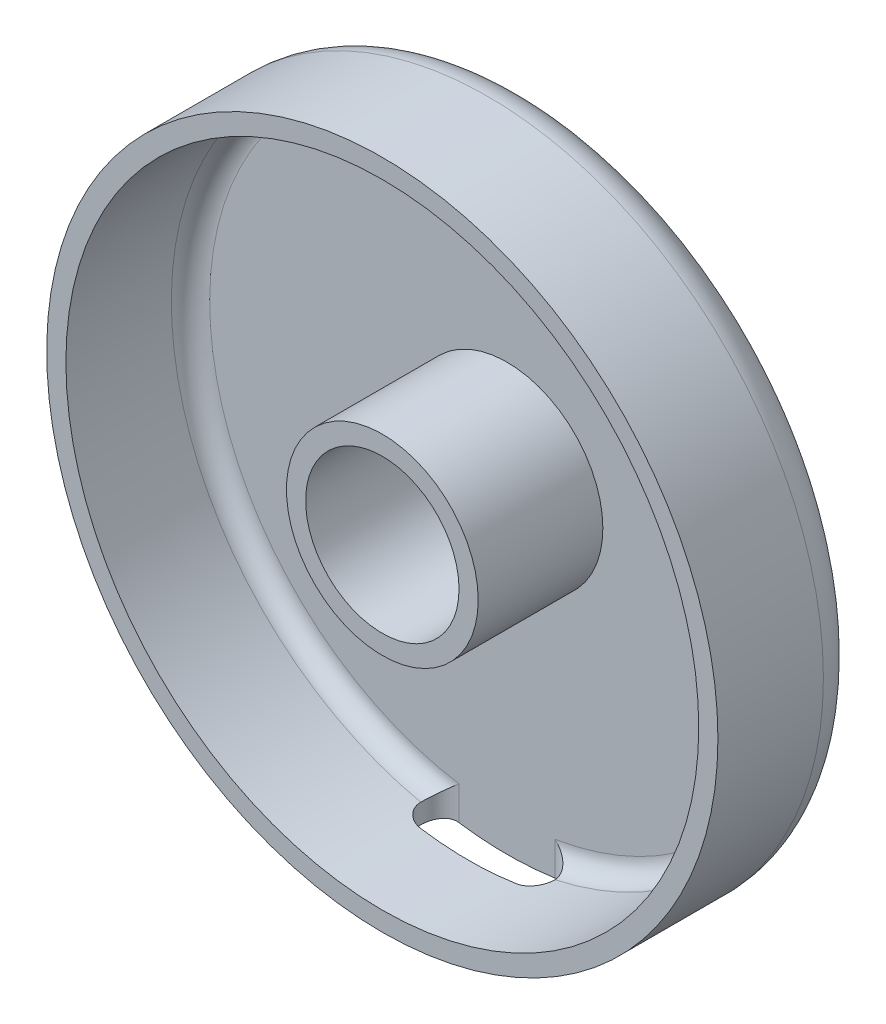
ISO-10303-21;
HEADER;
FILE_DESCRIPTION(('STEP AP214'),'2;1');
FILE_NAME('part.step','',(''),(''),'','','');
FILE_SCHEMA(('AUTOMOTIVE_DESIGN { 1 0 10303 214 1 1 1 1 }'));
ENDSEC;
DATA;
#1=APPLICATION_CONTEXT('core data for automotive mechanical design processes');
#2=APPLICATION_PROTOCOL_DEFINITION('international standard','automotive_design',2000,#1);
#3=PRODUCT_CONTEXT('',#1,'mechanical');
#4=PRODUCT('Part','Part','',(#3));
#5=PRODUCT_RELATED_PRODUCT_CATEGORY('part','',(#4));
#6=PRODUCT_DEFINITION_FORMATION('','',#4);
#7=PRODUCT_DEFINITION_CONTEXT('part definition',#1,'design');
#8=PRODUCT_DEFINITION('design','',#6,#7);
#9=PRODUCT_DEFINITION_SHAPE('','',#8);
#10=(LENGTH_UNIT() NAMED_UNIT(*) SI_UNIT(.MILLI.,.METRE.));
#11=(NAMED_UNIT(*) PLANE_ANGLE_UNIT() SI_UNIT($,.RADIAN.));
#12=(NAMED_UNIT(*) SI_UNIT($,.STERADIAN.) SOLID_ANGLE_UNIT());
#13=UNCERTAINTY_MEASURE_WITH_UNIT(LENGTH_MEASURE(1.E-05),#10,'distance_accuracy_value','');
#14=(GEOMETRIC_REPRESENTATION_CONTEXT(3) GLOBAL_UNCERTAINTY_ASSIGNED_CONTEXT((#13)) GLOBAL_UNIT_ASSIGNED_CONTEXT((#10,
#11,#12)) REPRESENTATION_CONTEXT('',''));
#15=CARTESIAN_POINT('',(0.,0.,0.));
#16=DIRECTION('',(0.,0.,1.));
#17=DIRECTION('',(1.,0.,0.));
#18=AXIS2_PLACEMENT_3D('',#15,#16,#17);
#19=CARTESIAN_POINT('',(0.,0.,15.));
#20=DIRECTION('',(0.,0.,1.));
#21=DIRECTION('',(1.,0.,0.));
#22=AXIS2_PLACEMENT_3D('',#19,#20,#21);
#23=PLANE('',#22);
#24=CARTESIAN_POINT('',(0.,0.,15.));
#25=DIRECTION('',(0.,0.,1.));
#26=DIRECTION('',(1.,0.,0.));
#27=AXIS2_PLACEMENT_3D('',#24,#25,#26);
#28=CIRCLE('',#27,8.);
#29=CARTESIAN_POINT('',(8.,0.,15.));
#30=VERTEX_POINT('',#29);
#31=EDGE_CURVE('E175',#30,#30,#28,.T.);
#32=ORIENTED_EDGE('',*,*,#31,.F.);
#33=EDGE_LOOP('',(#32));
#34=FACE_BOUND('',#33,.T.);
#35=CARTESIAN_POINT('',(0.,0.,15.));
#36=DIRECTION('',(0.,0.,1.));
#37=DIRECTION('',(1.,0.,0.));
#38=AXIS2_PLACEMENT_3D('',#35,#36,#37);
#39=CIRCLE('',#38,10.);
#40=CARTESIAN_POINT('',(10.,0.,15.));
#41=VERTEX_POINT('',#40);
#42=EDGE_CURVE('E98',#41,#41,#39,.T.);
#43=ORIENTED_EDGE('',*,*,#42,.T.);
#44=EDGE_LOOP('',(#43));
#45=FACE_BOUND('',#44,.T.);
#46=ADVANCED_FACE('F33',(#34,#45),#23,.T.);
#47=CARTESIAN_POINT('',(0.,0.,15.));
#48=DIRECTION('',(0.,0.,-1.));
#49=DIRECTION('',(-1.,0.,0.));
#50=AXIS2_PLACEMENT_3D('',#47,#48,#49);
#51=CYLINDRICAL_SURFACE('',#50,35.);
#52=CARTESIAN_POINT('',(0.,0.,4.));
#53=DIRECTION('',(0.,0.,1.));
#54=DIRECTION('',(1.,0.,0.));
#55=AXIS2_PLACEMENT_3D('',#52,#53,#54);
#56=CIRCLE('',#55,35.);
#57=CARTESIAN_POINT('',(7.,-34.2928563989645,4.));
#58=VERTEX_POINT('',#57);
#59=CARTESIAN_POINT('',(-7.,-34.2928563989645,4.));
#60=VERTEX_POINT('',#59);
#61=EDGE_CURVE('E192',#58,#60,#56,.T.);
#62=ORIENTED_EDGE('',*,*,#61,.T.);
#63=CARTESIAN_POINT('',(-7.,-34.2928563989645,4.));
#64=CARTESIAN_POINT('',(-7.00000024530008,-34.2928555590461,4.05551355530177));
#65=CARTESIAN_POINT('',(-6.99768719378157,-34.2933285851383,4.11100014356259));
#66=CARTESIAN_POINT('',(-6.9884636017292,-34.2952097134133,4.22156839814736));
#67=CARTESIAN_POINT('',(-6.9815535157915,-34.2966177231365,4.27665010396523));
#68=CARTESIAN_POINT('',(-6.95401289387718,-34.3022168043985,4.44052674764076));
#69=CARTESIAN_POINT('',(-6.92657168154917,-34.3077830497015,4.54821132621806));
#70=CARTESIAN_POINT('',(-6.85437600773371,-34.3222794650378,4.75732863114436));
#71=CARTESIAN_POINT('',(-6.80961750180681,-34.3312104208836,4.8587598906155));
#72=CARTESIAN_POINT('',(-6.70414730815314,-34.3519619063264,5.05264191439974));
#73=CARTESIAN_POINT('',(-6.64343523137788,-34.3637825063906,5.14509245963118));
#74=CARTESIAN_POINT('',(-6.50713708225238,-34.3898533831215,5.3194349637285));
#75=CARTESIAN_POINT('',(-6.43140571292647,-34.404127196416,5.40120969889844));
#76=CARTESIAN_POINT('',(-6.26760925689824,-34.4343432891605,5.55096207681369));
#77=CARTESIAN_POINT('',(-6.17954109511379,-34.4502859843465,5.61893626924223));
#78=CARTESIAN_POINT('',(-5.99184757603775,-34.4834307316268,5.74039033875451));
#79=CARTESIAN_POINT('',(-5.8920440114934,-34.5006501812278,5.793589890895));
#80=CARTESIAN_POINT('',(-5.68497216612578,-34.5353744470497,5.88241609208592));
#81=CARTESIAN_POINT('',(-5.57770742555432,-34.552879124954,5.9180510113413));
#82=CARTESIAN_POINT('',(-5.39164042562375,-34.5823109799937,5.96286384332794));
#83=CARTESIAN_POINT('',(-5.31395887068838,-34.5943352148722,5.97677250905686));
#84=CARTESIAN_POINT('',(-5.15754252987711,-34.6180022564221,5.99534108602722));
#85=CARTESIAN_POINT('',(-5.07880918450185,-34.6296455218188,6.00001255556704));
#86=CARTESIAN_POINT('',(-5.,-34.6410161513776,6.));
#87=B_SPLINE_CURVE_WITH_KNOTS('',3,(#63,#64,#65,#66,#67,#68,#69,#70,#71,#72,#73,#74,#75,#76,#77,
#78,#79,#80,#81,#82,#83,#84,#85,#86),.UNSPECIFIED.,.F.,.F.,(4,2,2,2,2,2,2,2,2,2,2,4),(0.,
0.166437126251119,0.332857796146538,0.66493476339948,0.997089333811798,1.32925200499525,
1.66480026794702,2.00043231934013,2.34205427832008,2.68351523257436,2.92248444549073,
3.16115445184396),.UNSPECIFIED.);
#88=CARTESIAN_POINT('',(-5.,-34.6410161513776,6.));
#89=VERTEX_POINT('',#88);
#90=EDGE_CURVE('E93',#60,#89,#87,.T.);
#91=ORIENTED_EDGE('',*,*,#90,.T.);
#92=CARTESIAN_POINT('',(0.,0.,6.));
#93=DIRECTION('',(0.,0.,1.));
#94=DIRECTION('',(1.,0.,0.));
#95=AXIS2_PLACEMENT_3D('',#92,#93,#94);
#96=CIRCLE('',#95,35.);
#97=CARTESIAN_POINT('',(5.,-34.6410161513776,6.));
#98=VERTEX_POINT('',#97);
#99=EDGE_CURVE('E86',#89,#98,#96,.T.);
#100=ORIENTED_EDGE('',*,*,#99,.T.);
#101=CARTESIAN_POINT('',(5.,-34.6410161513776,6.));
#102=CARTESIAN_POINT('',(5.05695062841561,-34.6327968394874,5.99999935998623));
#103=CARTESIAN_POINT('',(5.11385274952817,-34.6244393737466,5.99756603626248));
#104=CARTESIAN_POINT('',(5.22720720797549,-34.6075075796392,5.98786720303881));
#105=CARTESIAN_POINT('',(5.28365957576101,-34.5989332661213,5.98060202354457));
#106=CARTESIAN_POINT('',(5.45165220241039,-34.5729991146888,5.95163769943295));
#107=CARTESIAN_POINT('',(5.56200532845806,-34.5554024172875,5.92276954139059));
#108=CARTESIAN_POINT('',(5.77620788126942,-34.5202439513139,5.84673777672149));
#109=CARTESIAN_POINT('',(5.88005477947362,-34.5026821988584,5.79956710766766));
#110=CARTESIAN_POINT('',(6.07833427206034,-34.468303957287,5.68822765776918));
#111=CARTESIAN_POINT('',(6.17276832854968,-34.4514873526527,5.62406152252932));
#112=CARTESIAN_POINT('',(6.34945874201338,-34.4193615543715,5.48051100933139));
#113=CARTESIAN_POINT('',(6.43172247410127,-34.404051449698,5.40113591536918));
#114=CARTESIAN_POINT('',(6.58172257793654,-34.3756712008395,5.22929160065911));
#115=CARTESIAN_POINT('',(6.64945685510899,-34.3626013796695,5.13682049516819));
#116=CARTESIAN_POINT('',(6.76755997390268,-34.3395358476454,4.94260196129102));
#117=CARTESIAN_POINT('',(6.81812949674207,-34.3295047700626,4.84098066405441));
#118=CARTESIAN_POINT('',(6.90140198536068,-34.3128615635967,4.63044231809053));
#119=CARTESIAN_POINT('',(6.93412015993054,-34.3062465246136,4.52153156885347));
#120=CARTESIAN_POINT('',(6.9715504714405,-34.2986543055428,4.34315718701884));
#121=CARTESIAN_POINT('',(6.98221180130755,-34.2964838790439,4.27493567951671));
#122=CARTESIAN_POINT('',(6.99643525916125,-34.2935841079102,4.13782038199207));
#123=CARTESIAN_POINT('',(7.00000701015909,-34.2928528098919,4.06892763097816));
#124=CARTESIAN_POINT('',(7.,-34.2928563989645,4.));
#125=B_SPLINE_CURVE_WITH_KNOTS('',3,(#101,#102,#103,#104,#105,#106,#107,#108,#109,#110,#111,
#112,#113,#114,#115,#116,#117,#118,#119,#120,#121,#122,#123,#124),.UNSPECIFIED.,.F.,.F.,(4,2,2,
2,2,2,2,2,2,2,2,4),(0.,0.172514735017035,0.345017688847394,0.689492877116225,1.03410112113017,
1.37865575308445,1.72300072498184,2.06739530454463,2.40761227498084,2.74753893677924,
2.95443865653663,3.16105734922718),.UNSPECIFIED.);
#126=EDGE_CURVE('E91',#98,#58,#125,.T.);
#127=ORIENTED_EDGE('',*,*,#126,.T.);
#128=EDGE_LOOP('',(#62,#91,#100,#127));
#129=FACE_BOUND('',#128,.T.);
#130=CARTESIAN_POINT('',(0.,0.,15.));
#131=DIRECTION('',(0.,0.,1.));
#132=DIRECTION('',(1.,0.,0.));
#133=AXIS2_PLACEMENT_3D('',#130,#131,#132);
#134=CIRCLE('',#133,35.);
#135=CARTESIAN_POINT('',(35.,0.,15.));
#136=VERTEX_POINT('',#135);
#137=EDGE_CURVE('E181',#136,#136,#134,.T.);
#138=ORIENTED_EDGE('',*,*,#137,.F.);
#139=EDGE_LOOP('',(#138));
#140=FACE_BOUND('',#139,.T.);
#141=ADVANCED_FACE('F89',(#129,#140),#51,.T.);
#142=CARTESIAN_POINT('',(0.,0.,15.));
#143=DIRECTION('',(0.,0.,1.));
#144=DIRECTION('',(1.,0.,0.));
#145=AXIS2_PLACEMENT_3D('',#142,#143,#144);
#146=CIRCLE('',#145,33.);
#147=CARTESIAN_POINT('',(33.,0.,15.));
#148=VERTEX_POINT('',#147);
#149=EDGE_CURVE('E172',#148,#148,#146,.T.);
#150=ORIENTED_EDGE('',*,*,#149,.F.);
#151=EDGE_LOOP('',(#150));
#152=FACE_BOUND('',#151,.T.);
#153=ORIENTED_EDGE('',*,*,#137,.T.);
#154=EDGE_LOOP('',(#153));
#155=FACE_BOUND('',#154,.T.);
#156=ADVANCED_FACE('F222',(#152,#155),#23,.T.);
#157=CARTESIAN_POINT('',(0.,0.,0.));
#158=DIRECTION('',(0.,0.,1.));
#159=DIRECTION('',(1.,0.,0.));
#160=AXIS2_PLACEMENT_3D('',#157,#158,#159);
#161=PLANE('',#160);
#162=CARTESIAN_POINT('',(0.,0.,0.));
#163=DIRECTION('',(0.,0.,1.));
#164=DIRECTION('',(1.,0.,0.));
#165=AXIS2_PLACEMENT_3D('',#162,#163,#164);
#166=CIRCLE('',#165,31.);
#167=CARTESIAN_POINT('',(31.,0.,0.));
#168=VERTEX_POINT('',#167);
#169=EDGE_CURVE('E193',#168,#168,#166,.F.);
#170=ORIENTED_EDGE('',*,*,#169,.T.);
#171=EDGE_LOOP('',(#170));
#172=FACE_BOUND('',#171,.T.);
#173=CARTESIAN_POINT('',(0.,0.,0.));
#174=DIRECTION('',(0.,0.,1.));
#175=DIRECTION('',(1.,0.,0.));
#176=AXIS2_PLACEMENT_3D('',#173,#174,#175);
#177=CIRCLE('',#176,8.);
#178=CARTESIAN_POINT('',(8.,0.,0.));
#179=VERTEX_POINT('',#178);
#180=EDGE_CURVE('E178',#179,#179,#177,.T.);
#181=ORIENTED_EDGE('',*,*,#180,.T.);
#182=EDGE_LOOP('',(#181));
#183=FACE_BOUND('',#182,.T.);
#184=ADVANCED_FACE('F230',(#172,#183),#161,.F.);
#185=CARTESIAN_POINT('',(0.,0.,0.));
#186=DIRECTION('',(0.,0.,1.));
#187=DIRECTION('',(1.,0.,0.));
#188=AXIS2_PLACEMENT_3D('',#185,#186,#187);
#189=CYLINDRICAL_SURFACE('',#188,8.);
#190=ORIENTED_EDGE('',*,*,#180,.F.);
#191=EDGE_LOOP('',(#190));
#192=FACE_BOUND('',#191,.T.);
#193=ORIENTED_EDGE('',*,*,#31,.T.);
#194=EDGE_LOOP('',(#193));
#195=FACE_BOUND('',#194,.T.);
#196=ADVANCED_FACE('F155',(#192,#195),#189,.F.);
#197=CARTESIAN_POINT('',(0.,0.,15.));
#198=DIRECTION('',(0.,0.,-1.));
#199=DIRECTION('',(-1.,0.,0.));
#200=AXIS2_PLACEMENT_3D('',#197,#198,#199);
#201=CYLINDRICAL_SURFACE('',#200,33.);
#202=CARTESIAN_POINT('',(-7.,-32.2490309931942,4.));
#203=CARTESIAN_POINT('',(-7.00000032170768,-32.2490300845433,4.0554183653388));
#204=CARTESIAN_POINT('',(-6.99769511363743,-32.2495313853145,4.11080976076309));
#205=CARTESIAN_POINT('',(-6.98850331936834,-32.2515248339393,4.22118730574932));
#206=CARTESIAN_POINT('',(-6.98161721596992,-32.2530168773743,4.27617349740002));
#207=CARTESIAN_POINT('',(-6.95417489418794,-32.2589495136072,4.43975537249226));
#208=CARTESIAN_POINT('',(-6.92683433451888,-32.2648467475484,4.54724103786594));
#209=CARTESIAN_POINT('',(-6.85491812614406,-32.2802018550038,4.755965904393));
#210=CARTESIAN_POINT('',(-6.81033898978307,-32.2896604490312,4.85720383671519));
#211=CARTESIAN_POINT('',(-6.70531079680312,-32.311633739594,5.05072870338102));
#212=CARTESIAN_POINT('',(-6.64486096016607,-32.3241485863369,5.14301519747122));
#213=CARTESIAN_POINT('',(-6.50908636555804,-32.3517640090769,5.31719168869916));
#214=CARTESIAN_POINT('',(-6.43359905465917,-32.3668925782486,5.39895039837916));
#215=CARTESIAN_POINT('',(-6.27033243009698,-32.3989172663636,5.54871893968728));
#216=CARTESIAN_POINT('',(-6.18254997554881,-32.4158138366758,5.6167252472807));
#217=CARTESIAN_POINT('',(-5.99524752533596,-32.4509823782138,5.73845032167571));
#218=CARTESIAN_POINT('',(-5.89552708290978,-32.4692751675269,5.79185446027313));
#219=CARTESIAN_POINT('',(-5.68859069637451,-32.5061680039266,5.88109678797164));
#220=CARTESIAN_POINT('',(-5.58137819676597,-32.5247679068516,5.91694298947087));
#221=CARTESIAN_POINT('',(-5.39476606783739,-32.556145764789,5.96226281129005));
#222=CARTESIAN_POINT('',(-5.3164818995682,-32.5690239781842,5.97639536284738));
#223=CARTESIAN_POINT('',(-5.15882488343747,-32.5943702521645,5.9952646734719));
#224=CARTESIAN_POINT('',(-5.0794534928392,-32.6068387976806,6.00001296616534));
#225=CARTESIAN_POINT('',(-5.,-32.6190128606002,6.));
#226=B_SPLINE_CURVE_WITH_KNOTS('',3,(#202,#203,#204,#205,#206,#207,#208,#209,#210,#211,#212,
#213,#214,#215,#216,#217,#218,#219,#220,#221,#222,#223,#224,#225),.UNSPECIFIED.,.F.,.F.,(4,2,2,
2,2,2,2,2,2,2,2,4),(0.,0.166151569851381,0.332285631042078,0.663764025517769,0.995309518788622,
1.32687131001151,1.66223342130417,1.99768136009837,2.33987127835792,2.6819048956696,
2.92313431208806,3.16406706315745),.UNSPECIFIED.);
#227=CARTESIAN_POINT('',(-7.,-32.2490309931942,4.));
#228=VERTEX_POINT('',#227);
#229=CARTESIAN_POINT('',(-5.,-32.6190128606002,6.));
#230=VERTEX_POINT('',#229);
#231=EDGE_CURVE('E99',#228,#230,#226,.T.);
#232=ORIENTED_EDGE('',*,*,#231,.F.);
#233=CARTESIAN_POINT('',(0.,0.,4.));
#234=DIRECTION('',(0.,0.,1.));
#235=DIRECTION('',(1.,0.,0.));
#236=AXIS2_PLACEMENT_3D('',#233,#234,#235);
#237=CIRCLE('',#236,33.);
#238=CARTESIAN_POINT('',(7.,-32.2490309931942,4.));
#239=VERTEX_POINT('',#238);
#240=EDGE_CURVE('E189',#228,#239,#237,.F.);
#241=ORIENTED_EDGE('',*,*,#240,.T.);
#242=CARTESIAN_POINT('',(5.,-32.6190128606002,6.));
#243=CARTESIAN_POINT('',(5.05703788892853,-32.610270675137,5.99999932510374));
#244=CARTESIAN_POINT('',(5.11402444209582,-32.6013813296134,5.99755858384355));
#245=CARTESIAN_POINT('',(5.22754155933696,-32.5833715857668,5.98783131755712));
#246=CARTESIAN_POINT('',(5.2840721554855,-32.5742512038864,5.98054513645019));
#247=CARTESIAN_POINT('',(5.45229108586844,-32.5466645660512,5.95149898556187));
#248=CARTESIAN_POINT('',(5.56278263571616,-32.52794577425,5.92255117534897));
#249=CARTESIAN_POINT('',(5.77723499843109,-32.4905439043457,5.84631506738926));
#250=CARTESIAN_POINT('',(5.88119335472219,-32.4718608422076,5.79901991815695));
#251=CARTESIAN_POINT('',(6.07967080699351,-32.4352861337783,5.68738392280152));
#252=CARTESIAN_POINT('',(6.17419133790792,-32.4173943674092,5.62304567337479));
#253=CARTESIAN_POINT('',(6.35101731389473,-32.3832163411943,5.4791021739577));
#254=CARTESIAN_POINT('',(6.43333098677215,-32.3669290024229,5.39950729113726));
#255=CARTESIAN_POINT('',(6.58338632076632,-32.3367422268268,5.22716678173189));
#256=CARTESIAN_POINT('',(6.65112598633155,-32.3228431170636,5.13441935711112));
#257=CARTESIAN_POINT('',(6.76907851432686,-32.298346220925,4.93975601066958));
#258=CARTESIAN_POINT('',(6.81951902546768,-32.2877057693785,4.83798328855586));
#259=CARTESIAN_POINT('',(6.90250167300495,-32.2700679524697,4.62713171107798));
#260=CARTESIAN_POINT('',(6.93505966990316,-32.2630673591106,4.51805942655328));
#261=CARTESIAN_POINT('',(6.97205641319059,-32.255086818813,4.34011237756122));
#262=CARTESIAN_POINT('',(6.98252807544157,-32.2528198267005,4.27249072329926));
#263=CARTESIAN_POINT('',(6.99649852156503,-32.2497910932616,4.13659036793303));
#264=CARTESIAN_POINT('',(7.0000067095306,-32.2490273218645,4.06831267826646));
#265=CARTESIAN_POINT('',(7.,-32.2490309931942,4.));
#266=B_SPLINE_CURVE_WITH_KNOTS('',3,(#242,#243,#244,#245,#246,#247,#248,#249,#250,#251,#252,
#253,#254,#255,#256,#257,#258,#259,#260,#261,#262,#263,#264,#265),.UNSPECIFIED.,.F.,.F.,(4,2,2,
2,2,2,2,2,2,2,2,4),(0.,0.17300405358368,0.345995829007623,0.691451772923759,1.03703684555706,
1.38256929490764,1.72786777552686,2.07321350622467,2.41382258836363,2.75412908494541,
2.95918188228904,3.16395756923127),.UNSPECIFIED.);
#267=CARTESIAN_POINT('',(5.,-32.6190128606002,6.));
#268=VERTEX_POINT('',#267);
#269=EDGE_CURVE('E49',#268,#239,#266,.T.);
#270=ORIENTED_EDGE('',*,*,#269,.F.);
#271=CARTESIAN_POINT('',(0.,0.,6.));
#272=DIRECTION('',(0.,0.,1.));
#273=DIRECTION('',(1.,0.,0.));
#274=AXIS2_PLACEMENT_3D('',#271,#272,#273);
#275=CIRCLE('',#274,33.);
#276=EDGE_CURVE('E11',#230,#268,#275,.T.);
#277=ORIENTED_EDGE('',*,*,#276,.F.);
#278=EDGE_LOOP('',(#232,#241,#270,#277));
#279=FACE_BOUND('',#278,.T.);
#280=ORIENTED_EDGE('',*,*,#149,.T.);
#281=EDGE_LOOP('',(#280));
#282=FACE_BOUND('',#281,.T.);
#283=ADVANCED_FACE('F150',(#279,#282),#201,.F.);
#284=CARTESIAN_POINT('',(0.,0.,2.));
#285=DIRECTION('',(0.,0.,1.));
#286=DIRECTION('',(1.,0.,0.));
#287=AXIS2_PLACEMENT_3D('',#284,#285,#286);
#288=PLANE('',#287);
#289=CARTESIAN_POINT('',(0.,0.,2.));
#290=DIRECTION('',(0.,0.,1.));
#291=DIRECTION('',(1.,0.,0.));
#292=AXIS2_PLACEMENT_3D('',#289,#290,#291);
#293=CIRCLE('',#292,31.);
#294=CARTESIAN_POINT('',(5.,-30.5941170815567,2.));
#295=VERTEX_POINT('',#294);
#296=CARTESIAN_POINT('',(-5.,-30.5941170815567,2.));
#297=VERTEX_POINT('',#296);
#298=EDGE_CURVE('E186',#295,#297,#293,.T.);
#299=ORIENTED_EDGE('',*,*,#298,.T.);
#300=DIRECTION('',(0.,1.,0.));
#301=VECTOR('',#300,1.);
#302=CARTESIAN_POINT('',(-5.,-35.,2.));
#303=LINE('',#302,#301);
#304=CARTESIAN_POINT('',(-5.,-34.0994765376031,2.));
#305=VERTEX_POINT('',#304);
#306=EDGE_CURVE('E106',#305,#297,#303,.T.);
#307=ORIENTED_EDGE('',*,*,#306,.F.);
#308=CARTESIAN_POINT('',(0.,0.,2.));
#309=DIRECTION('',(0.,0.,-1.));
#310=DIRECTION('',(-1.,0.,0.));
#311=AXIS2_PLACEMENT_3D('',#308,#309,#310);
#312=CIRCLE('',#311,34.4641016151378);
#313=CARTESIAN_POINT('',(5.,-34.0994765376031,2.));
#314=VERTEX_POINT('',#313);
#315=EDGE_CURVE('E197',#305,#314,#312,.F.);
#316=ORIENTED_EDGE('',*,*,#315,.T.);
#317=DIRECTION('',(0.,1.,0.));
#318=VECTOR('',#317,1.);
#319=CARTESIAN_POINT('',(5.,-35.,2.));
#320=LINE('',#319,#318);
#321=EDGE_CURVE('E55',#314,#295,#320,.T.);
#322=ORIENTED_EDGE('',*,*,#321,.T.);
#323=EDGE_LOOP('',(#299,#307,#316,#322));
#324=FACE_BOUND('',#323,.T.);
#325=CARTESIAN_POINT('',(0.,0.,2.));
#326=DIRECTION('',(0.,0.,1.));
#327=DIRECTION('',(1.,0.,0.));
#328=AXIS2_PLACEMENT_3D('',#325,#326,#327);
#329=CIRCLE('',#328,10.);
#330=CARTESIAN_POINT('',(10.,0.,2.));
#331=VERTEX_POINT('',#330);
#332=EDGE_CURVE('E169',#331,#331,#329,.T.);
#333=ORIENTED_EDGE('',*,*,#332,.F.);
#334=EDGE_LOOP('',(#333));
#335=FACE_BOUND('',#334,.T.);
#336=ADVANCED_FACE('F154',(#324,#335),#288,.T.);
#337=CARTESIAN_POINT('',(0.,0.,0.));
#338=DIRECTION('',(0.,0.,1.));
#339=DIRECTION('',(1.,0.,0.));
#340=AXIS2_PLACEMENT_3D('',#337,#338,#339);
#341=CYLINDRICAL_SURFACE('',#340,10.);
#342=ORIENTED_EDGE('',*,*,#332,.T.);
#343=EDGE_LOOP('',(#342));
#344=FACE_BOUND('',#343,.T.);
#345=ORIENTED_EDGE('',*,*,#42,.F.);
#346=EDGE_LOOP('',(#345));
#347=FACE_BOUND('',#346,.T.);
#348=ADVANCED_FACE('F217',(#344,#347),#341,.T.);
#349=CARTESIAN_POINT('',(0.,0.,4.));
#350=DIRECTION('',(0.,0.,1.));
#351=DIRECTION('',(1.,0.,0.));
#352=AXIS2_PLACEMENT_3D('',#349,#350,#351);
#353=TOROIDAL_SURFACE('',#352,31.,2.);
#354=ORIENTED_EDGE('',*,*,#240,.F.);
#355=CARTESIAN_POINT('',(-6.99999999,-32.2490309851319,4.0002));
#356=CARTESIAN_POINT('',(-7.00001484640282,-32.2490426103239,3.95279878732765));
#357=CARTESIAN_POINT('',(-6.99832462977569,-32.2476802585834,3.90540389690484));
#358=CARTESIAN_POINT('',(-6.99161148872657,-32.2422674567667,3.81102991617514));
#359=CARTESIAN_POINT('',(-6.98659034796843,-32.2382184453593,3.76405061696093));
#360=CARTESIAN_POINT('',(-6.97333394934684,-32.2275253798901,3.67114886981485));
#361=CARTESIAN_POINT('',(-6.96511884969167,-32.22089760115,3.62522166984233));
#362=CARTESIAN_POINT('',(-6.94561984181705,-32.2051594248597,3.53446714534701));
#363=CARTESIAN_POINT('',(-6.93433567349655,-32.1960488168917,3.48963991439688));
#364=CARTESIAN_POINT('',(-6.89617622518014,-32.1652232758017,3.35743044878589));
#365=CARTESIAN_POINT('',(-6.86495634041712,-32.1399843076301,3.27206528001837));
#366=CARTESIAN_POINT('',(-6.7926132802856,-32.0814080826102,3.1086186444367));
#367=CARTESIAN_POINT('',(-6.75147674796166,-32.0480599027497,3.03054720018715));
#368=CARTESIAN_POINT('',(-6.6577581705554,-31.9719403946093,2.87728709962706));
#369=CARTESIAN_POINT('',(-6.60455580689062,-31.928655528664,2.80273556710219));
#370=CARTESIAN_POINT('',(-6.49084897974946,-31.8359278843265,2.66379463382257));
#371=CARTESIAN_POINT('',(-6.43034116918357,-31.7864822829756,2.59940992255074));
#372=CARTESIAN_POINT('',(-6.2721304988293,-31.6568601477921,2.45126575807724));
#373=CARTESIAN_POINT('',(-6.17092830764083,-31.5736564623281,2.37385950555279));
#374=CARTESIAN_POINT('',(-5.96046499440294,-31.3998689556251,2.24129739785219));
#375=CARTESIAN_POINT('',(-5.85118612777133,-31.3092688357473,2.18619236754821));
#376=CARTESIAN_POINT('',(-5.62051956716443,-31.1171472989718,2.09437911199694));
#377=CARTESIAN_POINT('',(-5.49881296498772,-31.0153017582281,2.05916893850445));
#378=CARTESIAN_POINT('',(-5.2535478008938,-30.809009962717,2.01222400219097));
#379=CARTESIAN_POINT('',(-5.12999428390842,-30.7045704083648,2.00043406761524));
#380=CARTESIAN_POINT('',(-5.00457376990817,-30.5980038548479,2.00000392405555));
#381=CARTESIAN_POINT('',(-5.00228680772403,-30.5960604959448,2.00000000202132));
#382=CARTESIAN_POINT('',(-5.,-30.5941170815567,2.));
#383=B_SPLINE_CURVE_WITH_KNOTS('',3,(#355,#356,#357,#358,#359,#360,#361,#362,#363,#364,#365,
#366,#367,#368,#369,#370,#371,#372,#373,#374,#375,#376,#377,#378,#379,#380,#381,#382),
.UNSPECIFIED.,.F.,.F.,(4,2,2,2,2,2,2,2,2,2,2,2,2,4),(0.,0.14214281623841,0.284209578337639,
0.425393893153759,0.566590176954808,0.84821382829728,1.13021894537185,1.43301964249942,
1.73595960211498,2.18999461998546,2.64505864211021,3.13093095113405,3.61565731247322,
3.62466072707662),.UNSPECIFIED.);
#384=EDGE_CURVE('E164',#228,#297,#383,.T.);
#385=ORIENTED_EDGE('',*,*,#384,.T.);
#386=ORIENTED_EDGE('',*,*,#298,.F.);
#387=CARTESIAN_POINT('',(5.,-30.5941170815567,2.));
#388=CARTESIAN_POINT('',(5.00228680530062,-30.596060493999,2.00000000241326));
#389=CARTESIAN_POINT('',(5.00457376748023,-30.5980038528967,2.00000392443024));
#390=CARTESIAN_POINT('',(5.13557923053089,-30.7093157861689,2.00045320025271));
#391=CARTESIAN_POINT('',(5.26476437213546,-30.8184898738567,2.01331569576353));
#392=CARTESIAN_POINT('',(5.5209627768132,-31.0338797135704,2.06461431542902));
#393=CARTESIAN_POINT('',(5.64797057666306,-31.1400883537962,2.10310719589956));
#394=CARTESIAN_POINT('',(5.88049451099174,-31.3335903525382,2.20039770766979));
#395=CARTESIAN_POINT('',(5.98671725557002,-31.4215920690103,2.256069422756));
#396=CARTESIAN_POINT('',(6.19120128659427,-31.5903395670071,2.38883431457846));
#397=CARTESIAN_POINT('',(6.28947543778914,-31.6710970972874,2.46589194455983));
#398=CARTESIAN_POINT('',(6.45386433346956,-31.80573009507,2.62294992981013));
#399=CARTESIAN_POINT('',(6.5223411583675,-31.8616448303582,2.69872201680249));
#400=CARTESIAN_POINT('',(6.64905059979442,-31.9648758556261,2.86359991150911));
#401=CARTESIAN_POINT('',(6.70729352651367,-32.0122008010356,2.95269213030394));
#402=CARTESIAN_POINT('',(6.80182450476143,-32.0888781267529,3.12730574559243));
#403=CARTESIAN_POINT('',(6.84015030585827,-32.1199082986452,3.21098261635888));
#404=CARTESIAN_POINT('',(6.90546334252445,-32.1727337330387,3.38531567025686));
#405=CARTESIAN_POINT('',(6.9324702313453,-32.1945450030652,3.47595942997076));
#406=CARTESIAN_POINT('',(6.96844237952133,-32.223580777246,3.63892362558995));
#407=CARTESIAN_POINT('',(6.98021900006908,-32.2330797526539,3.71022432119429));
#408=CARTESIAN_POINT('',(6.99205994586286,-32.2426290244688,3.81829111655349));
#409=CARTESIAN_POINT('',(6.99503633502045,-32.2450289716526,3.85455613918368));
#410=CARTESIAN_POINT('',(6.99900965996828,-32.2482325637896,3.9272774305957));
#411=CARTESIAN_POINT('',(7.00000589250847,-32.2490356416169,3.96373376271374));
#412=CARTESIAN_POINT('',(6.99999999,-32.249030985132,4.0002));
#413=B_SPLINE_CURVE_WITH_KNOTS('',3,(#387,#388,#389,#390,#391,#392,#393,#394,#395,#396,#397,
#398,#399,#400,#401,#402,#403,#404,#405,#406,#407,#408,#409,#410,#411,#412),.UNSPECIFIED.,.F.,
.F.,(4,2,2,2,2,2,2,2,2,2,2,2,4),(0.,0.0090034146034045,0.515714911301165,1.02355222599861,
1.46814127598731,1.91199572974529,2.26000900174994,2.60766963037855,2.89785633144063,
3.18753706699751,3.4054970980772,3.51481484846755,3.62417141598283),.UNSPECIFIED.);
#414=EDGE_CURVE('E105',#295,#239,#413,.T.);
#415=ORIENTED_EDGE('',*,*,#414,.T.);
#416=EDGE_LOOP('',(#354,#385,#386,#415));
#417=FACE_BOUND('',#416,.T.);
#418=ADVANCED_FACE('F212',(#417),#353,.F.);
#419=CARTESIAN_POINT('',(0.,0.,4.));
#420=DIRECTION('',(0.,0.,1.));
#421=DIRECTION('',(1.,0.,0.));
#422=AXIS2_PLACEMENT_3D('',#419,#420,#421);
#423=TOROIDAL_SURFACE('',#422,31.,4.);
#424=CARTESIAN_POINT('',(-6.99999999,-34.2928563959026,4.0002));
#425=CARTESIAN_POINT('',(-7.00001229755739,-34.2928655749281,3.94520710716796));
#426=CARTESIAN_POINT('',(-6.99774295280627,-34.2921654655153,3.89021825854975));
#427=CARTESIAN_POINT('',(-6.98869384167864,-34.2894021426535,3.78065913998069));
#428=CARTESIAN_POINT('',(-6.98191506402654,-34.2873392280095,3.72608878092557));
#429=CARTESIAN_POINT('',(-6.96392452530632,-34.2819131413242,3.61790058329553));
#430=CARTESIAN_POINT('',(-6.95272491922048,-34.2785535350691,3.56428055069335));
#431=CARTESIAN_POINT('',(-6.92600169857854,-34.2706452412114,3.45823296624109));
#432=CARTESIAN_POINT('',(-6.91047798049092,-34.2660965251383,3.4058054429756));
#433=CARTESIAN_POINT('',(-6.85760748321813,-34.2508703501367,3.25088626024712));
#434=CARTESIAN_POINT('',(-6.81393931334351,-34.2386057662242,3.15062680001904));
#435=CARTESIAN_POINT('',(-6.71109081404948,-34.2113884928983,2.95882760853532));
#436=CARTESIAN_POINT('',(-6.65190119316748,-34.1964341950562,2.86729314514608));
#437=CARTESIAN_POINT('',(-6.51766105886833,-34.1653974452068,2.69264863591021));
#438=CARTESIAN_POINT('',(-6.44221006175964,-34.149295065228,2.60984925055625));
#439=CARTESIAN_POINT('',(-6.27834428807827,-34.1189061227061,2.45781652053363));
#440=CARTESIAN_POINT('',(-6.18992769939203,-34.104619814505,2.38858507533002));
#441=CARTESIAN_POINT('',(-6.00125987753539,-34.0805406443846,2.26496928762886));
#442=CARTESIAN_POINT('',(-5.90089020694975,-34.0707984315024,2.2107549124249));
#443=CARTESIAN_POINT('',(-5.69204810664867,-34.058883022232,2.1201106362024));
#444=CARTESIAN_POINT('',(-5.58358678413507,-34.0566996384398,2.08365685538009));
#445=CARTESIAN_POINT('',(-5.39534185697439,-34.0611578720739,2.03783291734041));
#446=CARTESIAN_POINT('',(-5.3166413189653,-34.0653641125357,2.02362949516223));
#447=CARTESIAN_POINT('',(-5.15844927877507,-34.0786957157688,2.00468459096633));
#448=CARTESIAN_POINT('',(-5.07895712178698,-34.0878255529859,1.99995173402719));
#449=CARTESIAN_POINT('',(-4.9998,-34.0995058688025,2.00000001));
#450=B_SPLINE_CURVE_WITH_KNOTS('',3,(#424,#425,#426,#427,#428,#429,#430,#431,#432,#433,#434,
#435,#436,#437,#438,#439,#440,#441,#442,#443,#444,#445,#446,#447,#448,#449),.UNSPECIFIED.,.F.,
.F.,(4,2,2,2,2,2,2,2,2,2,2,2,4),(0.,0.164919852433633,0.32980355695985,0.494237039854566,
0.658674460092764,0.987154675993847,1.3158319776318,1.65378523652985,1.99178577398003,
2.33346862612775,2.67469079592113,2.9142550715955,3.15403742527708),.UNSPECIFIED.);
#451=EDGE_CURVE('E42',#60,#305,#450,.T.);
#452=ORIENTED_EDGE('',*,*,#451,.F.);
#453=ORIENTED_EDGE('',*,*,#61,.F.);
#454=CARTESIAN_POINT('',(4.9998,-34.0995058688025,2.00000001));
#455=CARTESIAN_POINT('',(5.05081618146971,-34.0920095016979,1.99998663585463));
#456=CARTESIAN_POINT('',(5.10198374369044,-34.0855390821955,2.00194169987575));
#457=CARTESIAN_POINT('',(5.20422559089393,-34.0746523289558,2.00979604115281));
#458=CARTESIAN_POINT('',(5.25529989015742,-34.070235648849,2.0156946529081));
#459=CARTESIAN_POINT('',(5.35677195041052,-34.0634696835505,2.03141171097801));
#460=CARTESIAN_POINT('',(5.40717160741495,-34.0611121457078,2.04121427865789));
#461=CARTESIAN_POINT('',(5.50710461786182,-34.058340351225,2.06467491349434));
#462=CARTESIAN_POINT('',(5.55663798204316,-34.0579260704786,2.07833293282126));
#463=CARTESIAN_POINT('',(5.70338138769724,-34.0593913903913,2.12496407385246));
#464=CARTESIAN_POINT('',(5.79883410258556,-34.0639731063638,2.16360972573894));
#465=CARTESIAN_POINT('',(5.98234319300553,-34.0786032764521,2.25485324514157));
#466=CARTESIAN_POINT('',(6.0703936080732,-34.0886560882273,2.30746221713264));
#467=CARTESIAN_POINT('',(6.24026785263026,-34.1125469163323,2.42744089751185));
#468=CARTESIAN_POINT('',(6.32173587339393,-34.1265123840988,2.49528887830426));
#469=CARTESIAN_POINT('',(6.47285506362491,-34.1557073858034,2.64284782990165));
#470=CARTESIAN_POINT('',(6.54250241141673,-34.1709373261902,2.72256262172246));
#471=CARTESIAN_POINT('',(6.67279829553032,-34.201562024457,2.89796401612074));
#472=CARTESIAN_POINT('',(6.73249223870831,-34.2168954279851,2.99437370700027));
#473=CARTESIAN_POINT('',(6.83486314248239,-34.2443820063922,3.19621324174513));
#474=CARTESIAN_POINT('',(6.87754902088121,-34.2565368467284,3.30163832327429));
#475=CARTESIAN_POINT('',(6.94039208265754,-34.2748302214944,3.505246617716));
#476=CARTESIAN_POINT('',(6.96267758634015,-34.2815256471771,3.60272079794578));
#477=CARTESIAN_POINT('',(6.98503823529612,-34.2882899189693,3.75074747630076));
#478=CARTESIAN_POINT('',(6.990647237018,-34.2899982611516,3.80044323112519));
#479=CARTESIAN_POINT('',(6.99813169384871,-34.2922840535766,3.90015296025079));
#480=CARTESIAN_POINT('',(7.00000624006099,-34.2928612285138,3.95016700904819));
#481=CARTESIAN_POINT('',(6.99999999,-34.2928563959026,4.0002));
#482=B_SPLINE_CURVE_WITH_KNOTS('',3,(#454,#455,#456,#457,#458,#459,#460,#461,#462,#463,#464,
#465,#466,#467,#468,#469,#470,#471,#472,#473,#474,#475,#476,#477,#478,#479,#480,#481),
.UNSPECIFIED.,.F.,.F.,(4,2,2,2,2,2,2,2,2,2,2,2,2,4),(0.,0.154644311395204,0.309262532090925,
0.463258190765726,0.617251939096861,0.924941138967601,1.23287576886167,1.55232169829531,
1.87187071007386,2.21350437461806,2.55495867463676,2.85432642438581,3.00431267325957,
3.15433542152042),.UNSPECIFIED.);
#483=EDGE_CURVE('E104',#314,#58,#482,.T.);
#484=ORIENTED_EDGE('',*,*,#483,.F.);
#485=ORIENTED_EDGE('',*,*,#315,.F.);
#486=EDGE_LOOP('',(#452,#453,#484,#485));
#487=FACE_BOUND('',#486,.T.);
#488=ORIENTED_EDGE('',*,*,#169,.F.);
#489=EDGE_LOOP('',(#488));
#490=FACE_BOUND('',#489,.T.);
#491=ADVANCED_FACE('F35',(#487,#490),#423,.T.);
#492=CARTESIAN_POINT('',(-5.,-35.,6.));
#493=DIRECTION('',(0.,0.,1.));
#494=DIRECTION('',(1.,0.,0.));
#495=AXIS2_PLACEMENT_3D('',#492,#493,#494);
#496=PLANE('',#495);
#497=DIRECTION('',(0.,1.,0.));
#498=VECTOR('',#497,1.);
#499=CARTESIAN_POINT('',(-5.,-35.,6.));
#500=LINE('',#499,#498);
#501=EDGE_CURVE('E110',#89,#230,#500,.T.);
#502=ORIENTED_EDGE('',*,*,#501,.T.);
#503=ORIENTED_EDGE('',*,*,#276,.T.);
#504=DIRECTION('',(0.,1.,0.));
#505=VECTOR('',#504,1.);
#506=CARTESIAN_POINT('',(5.,-35.,6.));
#507=LINE('',#506,#505);
#508=EDGE_CURVE('E102',#98,#268,#507,.T.);
#509=ORIENTED_EDGE('',*,*,#508,.F.);
#510=ORIENTED_EDGE('',*,*,#99,.F.);
#511=EDGE_LOOP('',(#502,#503,#509,#510));
#512=FACE_BOUND('',#511,.T.);
#513=ADVANCED_FACE('F108',(#512),#496,.F.);
#514=CARTESIAN_POINT('',(-5.,-35.,4.));
#515=DIRECTION('',(0.,1.,0.));
#516=DIRECTION('',(0.,0.,1.));
#517=AXIS2_PLACEMENT_3D('',#514,#515,#516);
#518=CYLINDRICAL_SURFACE('',#517,2.);
#519=ORIENTED_EDGE('',*,*,#231,.T.);
#520=ORIENTED_EDGE('',*,*,#501,.F.);
#521=ORIENTED_EDGE('',*,*,#90,.F.);
#522=ORIENTED_EDGE('',*,*,#451,.T.);
#523=ORIENTED_EDGE('',*,*,#306,.T.);
#524=ORIENTED_EDGE('',*,*,#384,.F.);
#525=EDGE_LOOP('',(#519,#520,#521,#522,#523,#524));
#526=FACE_BOUND('',#525,.T.);
#527=ADVANCED_FACE('F130',(#526),#518,.F.);
#528=CARTESIAN_POINT('',(5.,-35.,4.));
#529=DIRECTION('',(0.,1.,0.));
#530=DIRECTION('',(0.,0.,1.));
#531=AXIS2_PLACEMENT_3D('',#528,#529,#530);
#532=CYLINDRICAL_SURFACE('',#531,2.);
#533=ORIENTED_EDGE('',*,*,#269,.T.);
#534=ORIENTED_EDGE('',*,*,#414,.F.);
#535=ORIENTED_EDGE('',*,*,#321,.F.);
#536=ORIENTED_EDGE('',*,*,#483,.T.);
#537=ORIENTED_EDGE('',*,*,#126,.F.);
#538=ORIENTED_EDGE('',*,*,#508,.T.);
#539=EDGE_LOOP('',(#533,#534,#535,#536,#537,#538));
#540=FACE_BOUND('',#539,.T.);
#541=ADVANCED_FACE('F101',(#540),#532,.F.);
#542=CLOSED_SHELL('',(#46,#141,#156,#184,#196,#283,#336,#348,#418,#491,#513,#527,#541));
#543=MANIFOLD_SOLID_BREP('B2',#542);
#544=ADVANCED_BREP_SHAPE_REPRESENTATION('',(#18,#543),#14);
#545=SHAPE_DEFINITION_REPRESENTATION(#9,#544);
ENDSEC;
END-ISO-10303-21;
